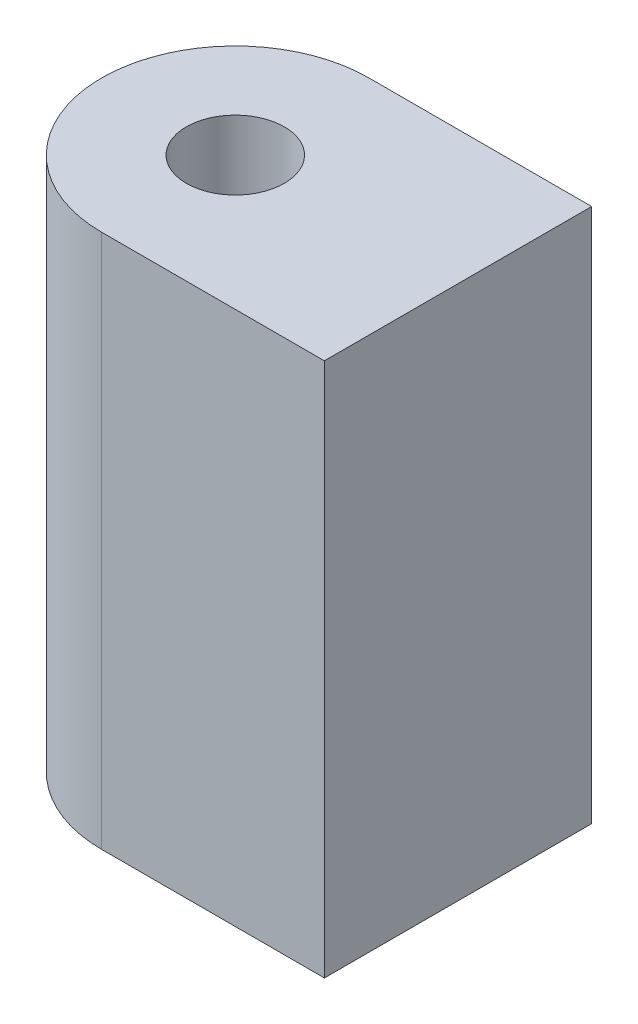
ISO-10303-21;
HEADER;
FILE_DESCRIPTION(('STEP AP214'),'2;1');
FILE_NAME('part.step','',(''),(''),'','','');
FILE_SCHEMA(('AUTOMOTIVE_DESIGN { 1 0 10303 214 1 1 1 1 }'));
ENDSEC;
DATA;
#1=APPLICATION_CONTEXT('core data for automotive mechanical design processes');
#2=APPLICATION_PROTOCOL_DEFINITION('international standard','automotive_design',2000,#1);
#3=PRODUCT_CONTEXT('',#1,'mechanical');
#4=PRODUCT('Part','Part','',(#3));
#5=PRODUCT_RELATED_PRODUCT_CATEGORY('part','',(#4));
#6=PRODUCT_DEFINITION_FORMATION('','',#4);
#7=PRODUCT_DEFINITION_CONTEXT('part definition',#1,'design');
#8=PRODUCT_DEFINITION('design','',#6,#7);
#9=PRODUCT_DEFINITION_SHAPE('','',#8);
#10=(LENGTH_UNIT() NAMED_UNIT(*) SI_UNIT(.MILLI.,.METRE.));
#11=(NAMED_UNIT(*) PLANE_ANGLE_UNIT() SI_UNIT($,.RADIAN.));
#12=(NAMED_UNIT(*) SI_UNIT($,.STERADIAN.) SOLID_ANGLE_UNIT());
#13=UNCERTAINTY_MEASURE_WITH_UNIT(LENGTH_MEASURE(1.E-05),#10,'distance_accuracy_value','');
#14=(GEOMETRIC_REPRESENTATION_CONTEXT(3) GLOBAL_UNCERTAINTY_ASSIGNED_CONTEXT((#13)) GLOBAL_UNIT_ASSIGNED_CONTEXT((#10,
#11,#12)) REPRESENTATION_CONTEXT('',''));
#15=CARTESIAN_POINT('',(0.,0.,0.));
#16=DIRECTION('',(0.,0.,1.));
#17=DIRECTION('',(1.,0.,0.));
#18=AXIS2_PLACEMENT_3D('',#15,#16,#17);
#19=CARTESIAN_POINT('',(-12.5,30.,0.));
#20=DIRECTION('',(0.,-1.,0.));
#21=DIRECTION('',(0.,0.,-1.));
#22=AXIS2_PLACEMENT_3D('',#19,#20,#21);
#23=PLANE('',#22);
#24=DIRECTION('',(0.,0.,-1.));
#25=VECTOR('',#24,1.);
#26=CARTESIAN_POINT('',(0.,30.,-7.5));
#27=LINE('',#26,#25);
#28=CARTESIAN_POINT('',(0.,30.,7.5));
#29=VERTEX_POINT('',#28);
#30=CARTESIAN_POINT('',(0.,30.,-7.5));
#31=VERTEX_POINT('',#30);
#32=EDGE_CURVE('E92',#29,#31,#27,.T.);
#33=ORIENTED_EDGE('',*,*,#32,.T.);
#34=DIRECTION('',(-1.,0.,0.));
#35=VECTOR('',#34,1.);
#36=CARTESIAN_POINT('',(0.,30.,-7.5));
#37=LINE('',#36,#35);
#38=CARTESIAN_POINT('',(-12.5,30.,-7.50000000000002));
#39=VERTEX_POINT('',#38);
#40=EDGE_CURVE('E87',#31,#39,#37,.T.);
#41=ORIENTED_EDGE('',*,*,#40,.T.);
#42=CARTESIAN_POINT('',(-12.5,30.,0.));
#43=DIRECTION('',(0.,1.,0.));
#44=DIRECTION('',(0.,0.,-1.));
#45=AXIS2_PLACEMENT_3D('',#42,#43,#44);
#46=CIRCLE('',#45,7.50000000000001);
#47=CARTESIAN_POINT('',(-12.5,30.,7.50000000000004));
#48=VERTEX_POINT('',#47);
#49=EDGE_CURVE('E90',#39,#48,#46,.T.);
#50=ORIENTED_EDGE('',*,*,#49,.T.);
#51=DIRECTION('',(1.,0.,0.));
#52=VECTOR('',#51,1.);
#53=CARTESIAN_POINT('',(0.,30.,7.5));
#54=LINE('',#53,#52);
#55=EDGE_CURVE('E57',#48,#29,#54,.T.);
#56=ORIENTED_EDGE('',*,*,#55,.T.);
#57=EDGE_LOOP('',(#33,#41,#50,#56));
#58=FACE_BOUND('',#57,.T.);
#59=CARTESIAN_POINT('',(-12.5,30.,0.));
#60=DIRECTION('',(0.,1.,0.));
#61=DIRECTION('',(0.,0.,1.));
#62=AXIS2_PLACEMENT_3D('',#59,#60,#61);
#63=CIRCLE('',#62,2.75000000000001);
#64=CARTESIAN_POINT('',(-12.5,30.,2.75000000000003));
#65=VERTEX_POINT('',#64);
#66=EDGE_CURVE('E112',#65,#65,#63,.T.);
#67=ORIENTED_EDGE('',*,*,#66,.F.);
#68=EDGE_LOOP('',(#67));
#69=FACE_BOUND('',#68,.T.);
#70=ADVANCED_FACE('F39',(#58,#69),#23,.F.);
#71=CARTESIAN_POINT('',(-12.5,0.,0.));
#72=DIRECTION('',(0.,-1.,0.));
#73=DIRECTION('',(0.,0.,-1.));
#74=AXIS2_PLACEMENT_3D('',#71,#72,#73);
#75=PLANE('',#74);
#76=DIRECTION('',(0.,0.,-1.));
#77=VECTOR('',#76,1.);
#78=CARTESIAN_POINT('',(0.,0.,-7.5));
#79=LINE('',#78,#77);
#80=CARTESIAN_POINT('',(0.,0.,7.5));
#81=VERTEX_POINT('',#80);
#82=CARTESIAN_POINT('',(0.,0.,-7.5));
#83=VERTEX_POINT('',#82);
#84=EDGE_CURVE('E108',#81,#83,#79,.T.);
#85=ORIENTED_EDGE('',*,*,#84,.F.);
#86=DIRECTION('',(1.,0.,0.));
#87=VECTOR('',#86,1.);
#88=CARTESIAN_POINT('',(0.,0.,7.5));
#89=LINE('',#88,#87);
#90=CARTESIAN_POINT('',(-12.5,0.,7.50000000000004));
#91=VERTEX_POINT('',#90);
#92=EDGE_CURVE('E80',#91,#81,#89,.T.);
#93=ORIENTED_EDGE('',*,*,#92,.F.);
#94=CARTESIAN_POINT('',(-12.5,0.,0.));
#95=DIRECTION('',(0.,1.,0.));
#96=DIRECTION('',(0.,0.,-1.));
#97=AXIS2_PLACEMENT_3D('',#94,#95,#96);
#98=CIRCLE('',#97,7.50000000000001);
#99=CARTESIAN_POINT('',(-12.5,0.,-7.50000000000002));
#100=VERTEX_POINT('',#99);
#101=EDGE_CURVE('E74',#100,#91,#98,.T.);
#102=ORIENTED_EDGE('',*,*,#101,.F.);
#103=DIRECTION('',(-1.,0.,0.));
#104=VECTOR('',#103,1.);
#105=CARTESIAN_POINT('',(0.,0.,-7.5));
#106=LINE('',#105,#104);
#107=EDGE_CURVE('E97',#83,#100,#106,.T.);
#108=ORIENTED_EDGE('',*,*,#107,.F.);
#109=EDGE_LOOP('',(#85,#93,#102,#108));
#110=FACE_BOUND('',#109,.T.);
#111=CARTESIAN_POINT('',(-12.5,0.,0.));
#112=DIRECTION('',(0.,1.,0.));
#113=DIRECTION('',(0.,0.,1.));
#114=AXIS2_PLACEMENT_3D('',#111,#112,#113);
#115=CIRCLE('',#114,2.75000000000001);
#116=CARTESIAN_POINT('',(-12.5,0.,2.75000000000003));
#117=VERTEX_POINT('',#116);
#118=EDGE_CURVE('E130',#117,#117,#115,.T.);
#119=ORIENTED_EDGE('',*,*,#118,.T.);
#120=EDGE_LOOP('',(#119));
#121=FACE_BOUND('',#120,.T.);
#122=ADVANCED_FACE('F125',(#110,#121),#75,.T.);
#123=CARTESIAN_POINT('',(0.,30.,-7.5));
#124=DIRECTION('',(-1.,0.,0.));
#125=DIRECTION('',(0.,0.,1.));
#126=AXIS2_PLACEMENT_3D('',#123,#124,#125);
#127=PLANE('',#126);
#128=ORIENTED_EDGE('',*,*,#84,.T.);
#129=DIRECTION('',(0.,-1.,0.));
#130=VECTOR('',#129,1.);
#131=CARTESIAN_POINT('',(0.,30.,-7.5));
#132=LINE('',#131,#130);
#133=EDGE_CURVE('E11',#31,#83,#132,.T.);
#134=ORIENTED_EDGE('',*,*,#133,.F.);
#135=ORIENTED_EDGE('',*,*,#32,.F.);
#136=DIRECTION('',(0.,-1.,0.));
#137=VECTOR('',#136,1.);
#138=CARTESIAN_POINT('',(0.,30.,7.5));
#139=LINE('',#138,#137);
#140=EDGE_CURVE('E104',#29,#81,#139,.T.);
#141=ORIENTED_EDGE('',*,*,#140,.T.);
#142=EDGE_LOOP('',(#128,#134,#135,#141));
#143=FACE_BOUND('',#142,.T.);
#144=ADVANCED_FACE('F41',(#143),#127,.F.);
#145=CARTESIAN_POINT('',(0.,30.,-7.5));
#146=DIRECTION('',(0.,0.,1.));
#147=DIRECTION('',(1.,0.,0.));
#148=AXIS2_PLACEMENT_3D('',#145,#146,#147);
#149=PLANE('',#148);
#150=ORIENTED_EDGE('',*,*,#107,.T.);
#151=DIRECTION('',(0.,-1.,0.));
#152=VECTOR('',#151,1.);
#153=CARTESIAN_POINT('',(-12.5,30.,-7.50000000000002));
#154=LINE('',#153,#152);
#155=EDGE_CURVE('E49',#39,#100,#154,.T.);
#156=ORIENTED_EDGE('',*,*,#155,.F.);
#157=ORIENTED_EDGE('',*,*,#40,.F.);
#158=ORIENTED_EDGE('',*,*,#133,.T.);
#159=EDGE_LOOP('',(#150,#156,#157,#158));
#160=FACE_BOUND('',#159,.T.);
#161=ADVANCED_FACE('F96',(#160),#149,.F.);
#162=CARTESIAN_POINT('',(-12.5,30.,0.));
#163=DIRECTION('',(0.,-1.,0.));
#164=DIRECTION('',(0.,0.,-1.));
#165=AXIS2_PLACEMENT_3D('',#162,#163,#164);
#166=CYLINDRICAL_SURFACE('',#165,7.50000000000001);
#167=ORIENTED_EDGE('',*,*,#101,.T.);
#168=DIRECTION('',(0.,-1.,0.));
#169=VECTOR('',#168,1.);
#170=CARTESIAN_POINT('',(-12.5,30.,7.50000000000004));
#171=LINE('',#170,#169);
#172=EDGE_CURVE('E99',#48,#91,#171,.T.);
#173=ORIENTED_EDGE('',*,*,#172,.F.);
#174=ORIENTED_EDGE('',*,*,#49,.F.);
#175=ORIENTED_EDGE('',*,*,#155,.T.);
#176=EDGE_LOOP('',(#167,#173,#174,#175));
#177=FACE_BOUND('',#176,.T.);
#178=ADVANCED_FACE('F100',(#177),#166,.T.);
#179=CARTESIAN_POINT('',(0.,30.,7.5));
#180=DIRECTION('',(0.,0.,-1.));
#181=DIRECTION('',(-1.,0.,0.));
#182=AXIS2_PLACEMENT_3D('',#179,#180,#181);
#183=PLANE('',#182);
#184=ORIENTED_EDGE('',*,*,#92,.T.);
#185=ORIENTED_EDGE('',*,*,#140,.F.);
#186=ORIENTED_EDGE('',*,*,#55,.F.);
#187=ORIENTED_EDGE('',*,*,#172,.T.);
#188=EDGE_LOOP('',(#184,#185,#186,#187));
#189=FACE_BOUND('',#188,.T.);
#190=ADVANCED_FACE('F122',(#189),#183,.F.);
#191=CARTESIAN_POINT('',(-12.5,30.,0.));
#192=DIRECTION('',(0.,-1.,0.));
#193=DIRECTION('',(0.,0.,-1.));
#194=AXIS2_PLACEMENT_3D('',#191,#192,#193);
#195=CYLINDRICAL_SURFACE('',#194,2.75000000000001);
#196=ORIENTED_EDGE('',*,*,#66,.T.);
#197=EDGE_LOOP('',(#196));
#198=FACE_BOUND('',#197,.T.);
#199=ORIENTED_EDGE('',*,*,#118,.F.);
#200=EDGE_LOOP('',(#199));
#201=FACE_BOUND('',#200,.T.);
#202=ADVANCED_FACE('F138',(#198,#201),#195,.F.);
#203=CLOSED_SHELL('',(#70,#122,#144,#161,#178,#190,#202));
#204=MANIFOLD_SOLID_BREP('B2',#203);
#205=ADVANCED_BREP_SHAPE_REPRESENTATION('',(#18,#204),#14);
#206=SHAPE_DEFINITION_REPRESENTATION(#9,#205);
ENDSEC;
END-ISO-10303-21;
